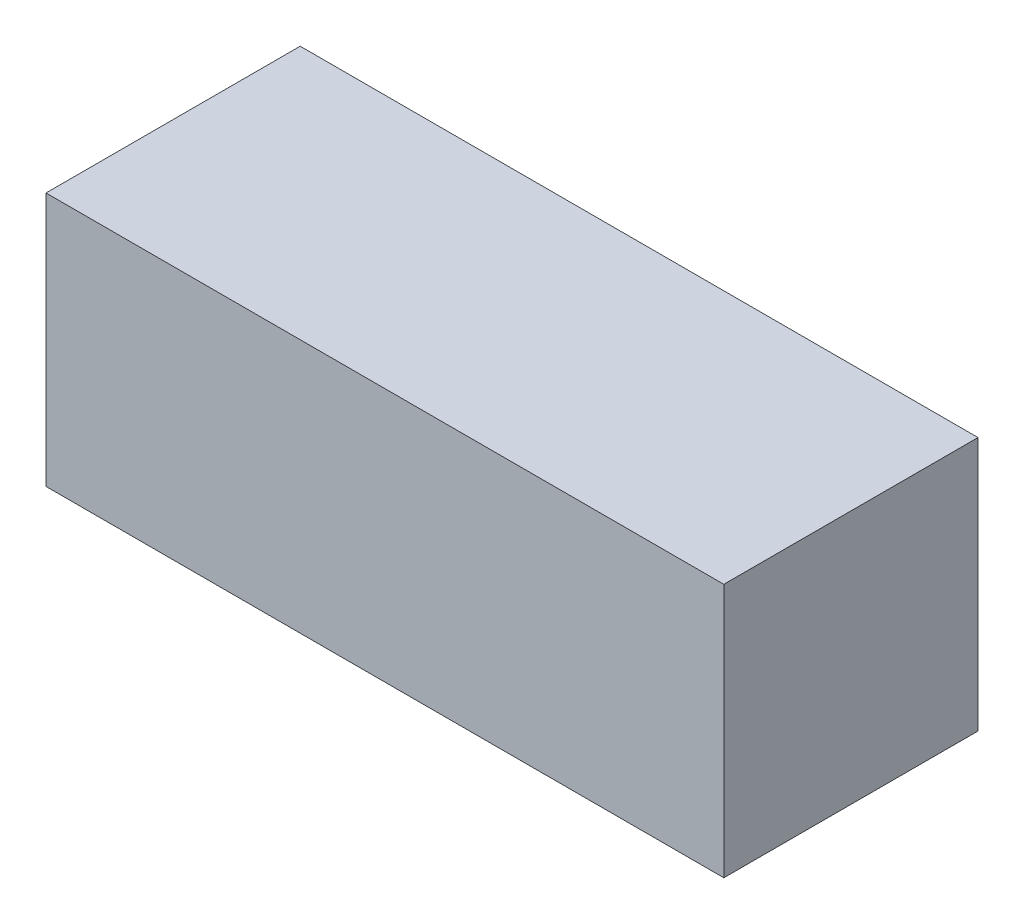
ISO-10303-21;
HEADER;
FILE_DESCRIPTION(('STEP AP214'),'2;1');
FILE_NAME('part.step','',(''),(''),'','','');
FILE_SCHEMA(('AUTOMOTIVE_DESIGN { 1 0 10303 214 1 1 1 1 }'));
ENDSEC;
DATA;
#1=APPLICATION_CONTEXT('core data for automotive mechanical design processes');
#2=APPLICATION_PROTOCOL_DEFINITION('international standard','automotive_design',2000,#1);
#3=PRODUCT_CONTEXT('',#1,'mechanical');
#4=PRODUCT('Part','Part','',(#3));
#5=PRODUCT_RELATED_PRODUCT_CATEGORY('part','',(#4));
#6=PRODUCT_DEFINITION_FORMATION('','',#4);
#7=PRODUCT_DEFINITION_CONTEXT('part definition',#1,'design');
#8=PRODUCT_DEFINITION('design','',#6,#7);
#9=PRODUCT_DEFINITION_SHAPE('','',#8);
#10=(LENGTH_UNIT() NAMED_UNIT(*) SI_UNIT(.MILLI.,.METRE.));
#11=(NAMED_UNIT(*) PLANE_ANGLE_UNIT() SI_UNIT($,.RADIAN.));
#12=(NAMED_UNIT(*) SI_UNIT($,.STERADIAN.) SOLID_ANGLE_UNIT());
#13=UNCERTAINTY_MEASURE_WITH_UNIT(LENGTH_MEASURE(1.E-05),#10,'distance_accuracy_value','');
#14=(GEOMETRIC_REPRESENTATION_CONTEXT(3) GLOBAL_UNCERTAINTY_ASSIGNED_CONTEXT((#13)) GLOBAL_UNIT_ASSIGNED_CONTEXT((#10,
#11,#12)) REPRESENTATION_CONTEXT('',''));
#15=CARTESIAN_POINT('',(0.,0.,0.));
#16=DIRECTION('',(0.,0.,1.));
#17=DIRECTION('',(1.,0.,0.));
#18=AXIS2_PLACEMENT_3D('',#15,#16,#17);
#19=CARTESIAN_POINT('',(0.,0.,6.));
#20=DIRECTION('',(1.,0.,0.));
#21=DIRECTION('',(0.,0.,-1.));
#22=AXIS2_PLACEMENT_3D('',#19,#20,#21);
#23=PLANE('',#22);
#24=DIRECTION('',(0.,-1.,0.));
#25=VECTOR('',#24,1.);
#26=CARTESIAN_POINT('',(0.,0.,0.));
#27=LINE('',#26,#25);
#28=CARTESIAN_POINT('',(0.,6.,0.));
#29=VERTEX_POINT('',#28);
#30=CARTESIAN_POINT('',(0.,0.,0.));
#31=VERTEX_POINT('',#30);
#32=EDGE_CURVE('E76',#29,#31,#27,.T.);
#33=ORIENTED_EDGE('',*,*,#32,.T.);
#34=DIRECTION('',(0.,0.,-1.));
#35=VECTOR('',#34,1.);
#36=CARTESIAN_POINT('',(0.,0.,6.));
#37=LINE('',#36,#35);
#38=CARTESIAN_POINT('',(0.,0.,6.));
#39=VERTEX_POINT('',#38);
#40=EDGE_CURVE('E11',#39,#31,#37,.T.);
#41=ORIENTED_EDGE('',*,*,#40,.F.);
#42=DIRECTION('',(0.,-1.,0.));
#43=VECTOR('',#42,1.);
#44=CARTESIAN_POINT('',(0.,0.,6.));
#45=LINE('',#44,#43);
#46=CARTESIAN_POINT('',(0.,6.,6.));
#47=VERTEX_POINT('',#46);
#48=EDGE_CURVE('E94',#47,#39,#45,.T.);
#49=ORIENTED_EDGE('',*,*,#48,.F.);
#50=DIRECTION('',(0.,0.,-1.));
#51=VECTOR('',#50,1.);
#52=CARTESIAN_POINT('',(0.,6.,6.));
#53=LINE('',#52,#51);
#54=EDGE_CURVE('E88',#47,#29,#53,.T.);
#55=ORIENTED_EDGE('',*,*,#54,.T.);
#56=EDGE_LOOP('',(#33,#41,#49,#55));
#57=FACE_BOUND('',#56,.T.);
#58=ADVANCED_FACE('F32',(#57),#23,.F.);
#59=CARTESIAN_POINT('',(0.,0.,6.));
#60=DIRECTION('',(0.,1.,0.));
#61=DIRECTION('',(0.,0.,1.));
#62=AXIS2_PLACEMENT_3D('',#59,#60,#61);
#63=PLANE('',#62);
#64=DIRECTION('',(1.,0.,0.));
#65=VECTOR('',#64,1.);
#66=CARTESIAN_POINT('',(0.,0.,0.));
#67=LINE('',#66,#65);
#68=CARTESIAN_POINT('',(16.,0.,0.));
#69=VERTEX_POINT('',#68);
#70=EDGE_CURVE('E72',#31,#69,#67,.T.);
#71=ORIENTED_EDGE('',*,*,#70,.T.);
#72=DIRECTION('',(0.,0.,-1.));
#73=VECTOR('',#72,1.);
#74=CARTESIAN_POINT('',(16.,0.,6.));
#75=LINE('',#74,#73);
#76=CARTESIAN_POINT('',(16.,0.,6.));
#77=VERTEX_POINT('',#76);
#78=EDGE_CURVE('E39',#77,#69,#75,.T.);
#79=ORIENTED_EDGE('',*,*,#78,.F.);
#80=DIRECTION('',(1.,0.,0.));
#81=VECTOR('',#80,1.);
#82=CARTESIAN_POINT('',(0.,0.,6.));
#83=LINE('',#82,#81);
#84=EDGE_CURVE('E84',#39,#77,#83,.T.);
#85=ORIENTED_EDGE('',*,*,#84,.F.);
#86=ORIENTED_EDGE('',*,*,#40,.T.);
#87=EDGE_LOOP('',(#71,#79,#85,#86));
#88=FACE_BOUND('',#87,.T.);
#89=ADVANCED_FACE('F83',(#88),#63,.F.);
#90=CARTESIAN_POINT('',(16.,0.,6.));
#91=DIRECTION('',(-1.,0.,0.));
#92=DIRECTION('',(0.,0.,1.));
#93=AXIS2_PLACEMENT_3D('',#90,#91,#92);
#94=PLANE('',#93);
#95=DIRECTION('',(0.,1.,0.));
#96=VECTOR('',#95,1.);
#97=CARTESIAN_POINT('',(16.,0.,0.));
#98=LINE('',#97,#96);
#99=CARTESIAN_POINT('',(16.,6.,0.));
#100=VERTEX_POINT('',#99);
#101=EDGE_CURVE('E77',#69,#100,#98,.T.);
#102=ORIENTED_EDGE('',*,*,#101,.T.);
#103=DIRECTION('',(0.,0.,-1.));
#104=VECTOR('',#103,1.);
#105=CARTESIAN_POINT('',(16.,6.,6.));
#106=LINE('',#105,#104);
#107=CARTESIAN_POINT('',(16.,6.,6.));
#108=VERTEX_POINT('',#107);
#109=EDGE_CURVE('E100',#108,#100,#106,.T.);
#110=ORIENTED_EDGE('',*,*,#109,.F.);
#111=DIRECTION('',(0.,1.,0.));
#112=VECTOR('',#111,1.);
#113=CARTESIAN_POINT('',(16.,0.,6.));
#114=LINE('',#113,#112);
#115=EDGE_CURVE('E51',#77,#108,#114,.T.);
#116=ORIENTED_EDGE('',*,*,#115,.F.);
#117=ORIENTED_EDGE('',*,*,#78,.T.);
#118=EDGE_LOOP('',(#102,#110,#116,#117));
#119=FACE_BOUND('',#118,.T.);
#120=ADVANCED_FACE('F103',(#119),#94,.F.);
#121=CARTESIAN_POINT('',(0.,6.,6.));
#122=DIRECTION('',(0.,-1.,0.));
#123=DIRECTION('',(1.,0.,0.));
#124=AXIS2_PLACEMENT_3D('',#121,#122,#123);
#125=PLANE('',#124);
#126=DIRECTION('',(-1.,0.,0.));
#127=VECTOR('',#126,1.);
#128=CARTESIAN_POINT('',(0.,6.,0.));
#129=LINE('',#128,#127);
#130=EDGE_CURVE('E92',#100,#29,#129,.T.);
#131=ORIENTED_EDGE('',*,*,#130,.T.);
#132=ORIENTED_EDGE('',*,*,#54,.F.);
#133=DIRECTION('',(-1.,0.,0.));
#134=VECTOR('',#133,1.);
#135=CARTESIAN_POINT('',(0.,6.,6.));
#136=LINE('',#135,#134);
#137=EDGE_CURVE('E46',#108,#47,#136,.T.);
#138=ORIENTED_EDGE('',*,*,#137,.F.);
#139=ORIENTED_EDGE('',*,*,#109,.T.);
#140=EDGE_LOOP('',(#131,#132,#138,#139));
#141=FACE_BOUND('',#140,.T.);
#142=ADVANCED_FACE('F105',(#141),#125,.F.);
#143=CARTESIAN_POINT('',(0.,0.,6.));
#144=DIRECTION('',(0.,0.,-1.));
#145=DIRECTION('',(-1.,0.,0.));
#146=AXIS2_PLACEMENT_3D('',#143,#144,#145);
#147=PLANE('',#146);
#148=ORIENTED_EDGE('',*,*,#48,.T.);
#149=ORIENTED_EDGE('',*,*,#84,.T.);
#150=ORIENTED_EDGE('',*,*,#115,.T.);
#151=ORIENTED_EDGE('',*,*,#137,.T.);
#152=EDGE_LOOP('',(#148,#149,#150,#151));
#153=FACE_BOUND('',#152,.T.);
#154=ADVANCED_FACE('F106',(#153),#147,.F.);
#155=CARTESIAN_POINT('',(0.,0.,0.));
#156=DIRECTION('',(0.,0.,-1.));
#157=DIRECTION('',(-1.,0.,0.));
#158=AXIS2_PLACEMENT_3D('',#155,#156,#157);
#159=PLANE('',#158);
#160=ORIENTED_EDGE('',*,*,#32,.F.);
#161=ORIENTED_EDGE('',*,*,#130,.F.);
#162=ORIENTED_EDGE('',*,*,#101,.F.);
#163=ORIENTED_EDGE('',*,*,#70,.F.);
#164=EDGE_LOOP('',(#160,#161,#162,#163));
#165=FACE_BOUND('',#164,.T.);
#166=ADVANCED_FACE('F73',(#165),#159,.T.);
#167=CLOSED_SHELL('',(#58,#89,#120,#142,#154,#166));
#168=MANIFOLD_SOLID_BREP('B2',#167);
#169=ADVANCED_BREP_SHAPE_REPRESENTATION('',(#18,#168),#14);
#170=SHAPE_DEFINITION_REPRESENTATION(#9,#169);
ENDSEC;
END-ISO-10303-21;
